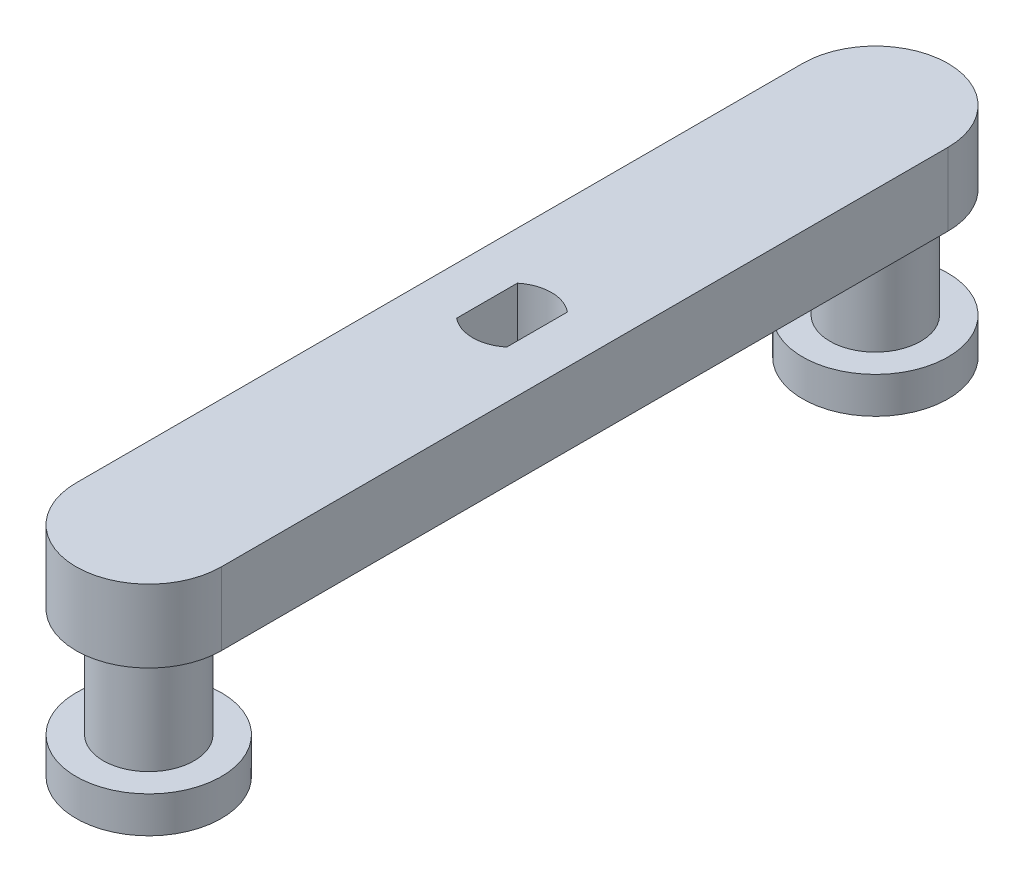
ISO-10303-21;
HEADER;
FILE_DESCRIPTION(('STEP AP214'),'2;1');
FILE_NAME('part.step','',(''),(''),'','','');
FILE_SCHEMA(('AUTOMOTIVE_DESIGN { 1 0 10303 214 1 1 1 1 }'));
ENDSEC;
DATA;
#1=APPLICATION_CONTEXT('core data for automotive mechanical design processes');
#2=APPLICATION_PROTOCOL_DEFINITION('international standard','automotive_design',2000,#1);
#3=PRODUCT_CONTEXT('',#1,'mechanical');
#4=PRODUCT('Part','Part','',(#3));
#5=PRODUCT_RELATED_PRODUCT_CATEGORY('part','',(#4));
#6=PRODUCT_DEFINITION_FORMATION('','',#4);
#7=PRODUCT_DEFINITION_CONTEXT('part definition',#1,'design');
#8=PRODUCT_DEFINITION('design','',#6,#7);
#9=PRODUCT_DEFINITION_SHAPE('','',#8);
#10=(LENGTH_UNIT() NAMED_UNIT(*) SI_UNIT(.MILLI.,.METRE.));
#11=(NAMED_UNIT(*) PLANE_ANGLE_UNIT() SI_UNIT($,.RADIAN.));
#12=(NAMED_UNIT(*) SI_UNIT($,.STERADIAN.) SOLID_ANGLE_UNIT());
#13=UNCERTAINTY_MEASURE_WITH_UNIT(LENGTH_MEASURE(1.E-05),#10,'distance_accuracy_value','');
#14=(GEOMETRIC_REPRESENTATION_CONTEXT(3) GLOBAL_UNCERTAINTY_ASSIGNED_CONTEXT((#13)) GLOBAL_UNIT_ASSIGNED_CONTEXT((#10,
#11,#12)) REPRESENTATION_CONTEXT('',''));
#15=CARTESIAN_POINT('',(0.,0.,0.));
#16=DIRECTION('',(0.,0.,1.));
#17=DIRECTION('',(1.,0.,0.));
#18=AXIS2_PLACEMENT_3D('',#15,#16,#17);
#19=CARTESIAN_POINT('',(0.,5.08,25.4));
#20=DIRECTION('',(0.,-1.,0.));
#21=DIRECTION('',(0.,0.,-1.));
#22=AXIS2_PLACEMENT_3D('',#19,#20,#21);
#23=CYLINDRICAL_SURFACE('',#22,5.08);
#24=CARTESIAN_POINT('',(0.,0.,25.4));
#25=DIRECTION('',(0.,1.,0.));
#26=DIRECTION('',(0.,0.,1.));
#27=AXIS2_PLACEMENT_3D('',#24,#25,#26);
#28=CIRCLE('',#27,5.08);
#29=CARTESIAN_POINT('',(-5.08,0.,25.4));
#30=VERTEX_POINT('',#29);
#31=CARTESIAN_POINT('',(5.08,0.,25.4));
#32=VERTEX_POINT('',#31);
#33=EDGE_CURVE('E151',#30,#32,#28,.T.);
#34=ORIENTED_EDGE('',*,*,#33,.T.);
#35=DIRECTION('',(0.,-1.,0.));
#36=VECTOR('',#35,1.);
#37=CARTESIAN_POINT('',(5.08,5.08,25.4));
#38=LINE('',#37,#36);
#39=CARTESIAN_POINT('',(5.08,5.08,25.4));
#40=VERTEX_POINT('',#39);
#41=EDGE_CURVE('E178',#40,#32,#38,.T.);
#42=ORIENTED_EDGE('',*,*,#41,.F.);
#43=CARTESIAN_POINT('',(0.,5.08,25.4));
#44=DIRECTION('',(0.,1.,0.));
#45=DIRECTION('',(0.,0.,1.));
#46=AXIS2_PLACEMENT_3D('',#43,#44,#45);
#47=CIRCLE('',#46,5.08);
#48=CARTESIAN_POINT('',(-5.08,5.08,25.4));
#49=VERTEX_POINT('',#48);
#50=EDGE_CURVE('E152',#49,#40,#47,.T.);
#51=ORIENTED_EDGE('',*,*,#50,.F.);
#52=DIRECTION('',(0.,-1.,0.));
#53=VECTOR('',#52,1.);
#54=CARTESIAN_POINT('',(-5.08,5.08,25.4));
#55=LINE('',#54,#53);
#56=EDGE_CURVE('E162',#49,#30,#55,.T.);
#57=ORIENTED_EDGE('',*,*,#56,.T.);
#58=EDGE_LOOP('',(#34,#42,#51,#57));
#59=FACE_BOUND('',#58,.T.);
#60=ADVANCED_FACE('F33',(#59),#23,.T.);
#61=CARTESIAN_POINT('',(5.08,5.08,25.4));
#62=DIRECTION('',(-1.,0.,0.));
#63=DIRECTION('',(0.,0.,1.));
#64=AXIS2_PLACEMENT_3D('',#61,#62,#63);
#65=PLANE('',#64);
#66=DIRECTION('',(0.,0.,-1.));
#67=VECTOR('',#66,1.);
#68=CARTESIAN_POINT('',(5.08,0.,25.4));
#69=LINE('',#68,#67);
#70=CARTESIAN_POINT('',(5.08,0.,-25.4));
#71=VERTEX_POINT('',#70);
#72=EDGE_CURVE('E165',#32,#71,#69,.T.);
#73=ORIENTED_EDGE('',*,*,#72,.T.);
#74=DIRECTION('',(0.,-1.,0.));
#75=VECTOR('',#74,1.);
#76=CARTESIAN_POINT('',(5.08,5.08,-25.4));
#77=LINE('',#76,#75);
#78=CARTESIAN_POINT('',(5.08,5.08,-25.4));
#79=VERTEX_POINT('',#78);
#80=EDGE_CURVE('E175',#79,#71,#77,.T.);
#81=ORIENTED_EDGE('',*,*,#80,.F.);
#82=DIRECTION('',(0.,0.,-1.));
#83=VECTOR('',#82,1.);
#84=CARTESIAN_POINT('',(5.08,5.08,25.4));
#85=LINE('',#84,#83);
#86=EDGE_CURVE('E155',#40,#79,#85,.T.);
#87=ORIENTED_EDGE('',*,*,#86,.F.);
#88=ORIENTED_EDGE('',*,*,#41,.T.);
#89=EDGE_LOOP('',(#73,#81,#87,#88));
#90=FACE_BOUND('',#89,.T.);
#91=ADVANCED_FACE('F205',(#90),#65,.F.);
#92=CARTESIAN_POINT('',(0.,5.08,-25.4));
#93=DIRECTION('',(0.,-1.,0.));
#94=DIRECTION('',(0.,0.,-1.));
#95=AXIS2_PLACEMENT_3D('',#92,#93,#94);
#96=CYLINDRICAL_SURFACE('',#95,5.08);
#97=CARTESIAN_POINT('',(0.,0.,-25.4));
#98=DIRECTION('',(0.,1.,0.));
#99=DIRECTION('',(0.,0.,1.));
#100=AXIS2_PLACEMENT_3D('',#97,#98,#99);
#101=CIRCLE('',#100,5.08);
#102=CARTESIAN_POINT('',(-5.08,0.,-25.4));
#103=VERTEX_POINT('',#102);
#104=EDGE_CURVE('E167',#71,#103,#101,.T.);
#105=ORIENTED_EDGE('',*,*,#104,.T.);
#106=DIRECTION('',(0.,-1.,0.));
#107=VECTOR('',#106,1.);
#108=CARTESIAN_POINT('',(-5.08,5.08,-25.4));
#109=LINE('',#108,#107);
#110=CARTESIAN_POINT('',(-5.08,5.08,-25.4));
#111=VERTEX_POINT('',#110);
#112=EDGE_CURVE('E172',#111,#103,#109,.T.);
#113=ORIENTED_EDGE('',*,*,#112,.F.);
#114=CARTESIAN_POINT('',(0.,5.08,-25.4));
#115=DIRECTION('',(0.,1.,0.));
#116=DIRECTION('',(0.,0.,1.));
#117=AXIS2_PLACEMENT_3D('',#114,#115,#116);
#118=CIRCLE('',#117,5.08);
#119=EDGE_CURVE('E158',#79,#111,#118,.T.);
#120=ORIENTED_EDGE('',*,*,#119,.F.);
#121=ORIENTED_EDGE('',*,*,#80,.T.);
#122=EDGE_LOOP('',(#105,#113,#120,#121));
#123=FACE_BOUND('',#122,.T.);
#124=ADVANCED_FACE('F202',(#123),#96,.T.);
#125=CARTESIAN_POINT('',(-5.08,5.08,-25.4));
#126=DIRECTION('',(1.,0.,0.));
#127=DIRECTION('',(0.,0.,-1.));
#128=AXIS2_PLACEMENT_3D('',#125,#126,#127);
#129=PLANE('',#128);
#130=DIRECTION('',(0.,0.,1.));
#131=VECTOR('',#130,1.);
#132=CARTESIAN_POINT('',(-5.08,0.,-25.4));
#133=LINE('',#132,#131);
#134=EDGE_CURVE('E156',#103,#30,#133,.T.);
#135=ORIENTED_EDGE('',*,*,#134,.T.);
#136=ORIENTED_EDGE('',*,*,#56,.F.);
#137=DIRECTION('',(0.,0.,1.));
#138=VECTOR('',#137,1.);
#139=CARTESIAN_POINT('',(-5.08,5.08,-25.4));
#140=LINE('',#139,#138);
#141=EDGE_CURVE('E160',#111,#49,#140,.T.);
#142=ORIENTED_EDGE('',*,*,#141,.F.);
#143=ORIENTED_EDGE('',*,*,#112,.T.);
#144=EDGE_LOOP('',(#135,#136,#142,#143));
#145=FACE_BOUND('',#144,.T.);
#146=ADVANCED_FACE('F198',(#145),#129,.F.);
#147=CARTESIAN_POINT('',(0.,5.08,25.4));
#148=DIRECTION('',(0.,1.,0.));
#149=DIRECTION('',(0.,0.,1.));
#150=AXIS2_PLACEMENT_3D('',#147,#148,#149);
#151=PLANE('',#150);
#152=CARTESIAN_POINT('',(0.,5.08,0.));
#153=DIRECTION('',(0.,1.,0.));
#154=DIRECTION('',(0.,0.,1.));
#155=AXIS2_PLACEMENT_3D('',#152,#153,#154);
#156=CIRCLE('',#155,2.75);
#157=CARTESIAN_POINT('',(-1.75,5.08,2.12132034355964));
#158=VERTEX_POINT('',#157);
#159=CARTESIAN_POINT('',(1.75,5.08,2.12132034355964));
#160=VERTEX_POINT('',#159);
#161=EDGE_CURVE('E47',#158,#160,#156,.T.);
#162=ORIENTED_EDGE('',*,*,#161,.F.);
#163=DIRECTION('',(0.,0.,1.));
#164=VECTOR('',#163,1.);
#165=CARTESIAN_POINT('',(-1.75,5.08,-2.12132034355964));
#166=LINE('',#165,#164);
#167=CARTESIAN_POINT('',(-1.75,5.08,-2.12132034355964));
#168=VERTEX_POINT('',#167);
#169=EDGE_CURVE('E105',#168,#158,#166,.T.);
#170=ORIENTED_EDGE('',*,*,#169,.F.);
#171=CARTESIAN_POINT('',(0.,5.08,0.));
#172=DIRECTION('',(0.,1.,0.));
#173=DIRECTION('',(0.,0.,1.));
#174=AXIS2_PLACEMENT_3D('',#171,#172,#173);
#175=CIRCLE('',#174,2.75);
#176=CARTESIAN_POINT('',(1.75,5.08,-2.12132034355964));
#177=VERTEX_POINT('',#176);
#178=EDGE_CURVE('E125',#177,#168,#175,.T.);
#179=ORIENTED_EDGE('',*,*,#178,.F.);
#180=DIRECTION('',(0.,0.,-1.));
#181=VECTOR('',#180,1.);
#182=CARTESIAN_POINT('',(1.75,5.08,-2.12132034355964));
#183=LINE('',#182,#181);
#184=EDGE_CURVE('E119',#160,#177,#183,.T.);
#185=ORIENTED_EDGE('',*,*,#184,.F.);
#186=EDGE_LOOP('',(#162,#170,#179,#185));
#187=FACE_BOUND('',#186,.T.);
#188=ORIENTED_EDGE('',*,*,#50,.T.);
#189=ORIENTED_EDGE('',*,*,#86,.T.);
#190=ORIENTED_EDGE('',*,*,#119,.T.);
#191=ORIENTED_EDGE('',*,*,#141,.T.);
#192=EDGE_LOOP('',(#188,#189,#190,#191));
#193=FACE_BOUND('',#192,.T.);
#194=ADVANCED_FACE('F187',(#187,#193),#151,.T.);
#195=CARTESIAN_POINT('',(0.,0.,25.4));
#196=DIRECTION('',(0.,1.,0.));
#197=DIRECTION('',(0.,0.,1.));
#198=AXIS2_PLACEMENT_3D('',#195,#196,#197);
#199=PLANE('',#198);
#200=DIRECTION('',(0.,0.,-1.));
#201=VECTOR('',#200,1.);
#202=CARTESIAN_POINT('',(-1.75,0.,-2.12132034355964));
#203=LINE('',#202,#201);
#204=CARTESIAN_POINT('',(-1.75,0.,2.12132034355964));
#205=VERTEX_POINT('',#204);
#206=CARTESIAN_POINT('',(-1.75,0.,-2.12132034355964));
#207=VERTEX_POINT('',#206);
#208=EDGE_CURVE('E117',#205,#207,#203,.T.);
#209=ORIENTED_EDGE('',*,*,#208,.F.);
#210=CARTESIAN_POINT('',(0.,0.,0.));
#211=DIRECTION('',(0.,1.,0.));
#212=DIRECTION('',(0.,0.,1.));
#213=AXIS2_PLACEMENT_3D('',#210,#211,#212);
#214=CIRCLE('',#213,2.75);
#215=CARTESIAN_POINT('',(1.75,0.,2.12132034355964));
#216=VERTEX_POINT('',#215);
#217=EDGE_CURVE('E99',#216,#205,#214,.F.);
#218=ORIENTED_EDGE('',*,*,#217,.F.);
#219=DIRECTION('',(0.,0.,1.));
#220=VECTOR('',#219,1.);
#221=CARTESIAN_POINT('',(1.75,0.,-2.12132034355964));
#222=LINE('',#221,#220);
#223=CARTESIAN_POINT('',(1.75,0.,-2.12132034355964));
#224=VERTEX_POINT('',#223);
#225=EDGE_CURVE('E108',#224,#216,#222,.T.);
#226=ORIENTED_EDGE('',*,*,#225,.F.);
#227=CARTESIAN_POINT('',(0.,0.,0.));
#228=DIRECTION('',(0.,1.,0.));
#229=DIRECTION('',(0.,0.,1.));
#230=AXIS2_PLACEMENT_3D('',#227,#228,#229);
#231=CIRCLE('',#230,2.75);
#232=EDGE_CURVE('E55',#207,#224,#231,.F.);
#233=ORIENTED_EDGE('',*,*,#232,.F.);
#234=EDGE_LOOP('',(#209,#218,#226,#233));
#235=FACE_BOUND('',#234,.T.);
#236=CARTESIAN_POINT('',(0.,0.,-25.4));
#237=DIRECTION('',(0.,1.,0.));
#238=DIRECTION('',(0.,0.,1.));
#239=AXIS2_PLACEMENT_3D('',#236,#237,#238);
#240=CIRCLE('',#239,3.175);
#241=CARTESIAN_POINT('',(0.,0.,-22.225));
#242=VERTEX_POINT('',#241);
#243=EDGE_CURVE('E11',#242,#242,#240,.F.);
#244=ORIENTED_EDGE('',*,*,#243,.F.);
#245=EDGE_LOOP('',(#244));
#246=FACE_BOUND('',#245,.T.);
#247=CARTESIAN_POINT('',(0.,0.,25.4));
#248=DIRECTION('',(0.,1.,0.));
#249=DIRECTION('',(0.,0.,1.));
#250=AXIS2_PLACEMENT_3D('',#247,#248,#249);
#251=CIRCLE('',#250,3.175);
#252=CARTESIAN_POINT('',(0.,0.,28.575));
#253=VERTEX_POINT('',#252);
#254=EDGE_CURVE('E40',#253,#253,#251,.F.);
#255=ORIENTED_EDGE('',*,*,#254,.F.);
#256=EDGE_LOOP('',(#255));
#257=FACE_BOUND('',#256,.T.);
#258=ORIENTED_EDGE('',*,*,#33,.F.);
#259=ORIENTED_EDGE('',*,*,#134,.F.);
#260=ORIENTED_EDGE('',*,*,#104,.F.);
#261=ORIENTED_EDGE('',*,*,#72,.F.);
#262=EDGE_LOOP('',(#258,#259,#260,#261));
#263=FACE_BOUND('',#262,.T.);
#264=ADVANCED_FACE('F114',(#235,#246,#257,#263),#199,.F.);
#265=CARTESIAN_POINT('',(0.,-7.62,25.4));
#266=DIRECTION('',(0.,1.,0.));
#267=DIRECTION('',(0.,0.,1.));
#268=AXIS2_PLACEMENT_3D('',#265,#266,#267);
#269=CYLINDRICAL_SURFACE('',#268,3.175);
#270=CARTESIAN_POINT('',(0.,-7.62,25.4));
#271=DIRECTION('',(0.,-1.,0.));
#272=DIRECTION('',(0.,0.,-1.));
#273=AXIS2_PLACEMENT_3D('',#270,#271,#272);
#274=CIRCLE('',#273,3.175);
#275=CARTESIAN_POINT('',(0.,-7.62,28.575));
#276=VERTEX_POINT('',#275);
#277=EDGE_CURVE('E148',#276,#276,#274,.T.);
#278=CARTESIAN_POINT('',(0.,-7.62,28.575));
#279=CARTESIAN_POINT('',(0.,-7.540625,28.575));
#280=CARTESIAN_POINT('',(0.,-7.46125,28.575));
#281=CARTESIAN_POINT('',(0.,-7.3025,28.575));
#282=CARTESIAN_POINT('',(0.,-7.223125,28.575));
#283=CARTESIAN_POINT('',(0.,-7.064375,28.575));
#284=CARTESIAN_POINT('',(0.,-6.985,28.575));
#285=CARTESIAN_POINT('',(0.,-6.82625,28.575));
#286=CARTESIAN_POINT('',(0.,-6.746875,28.575));
#287=CARTESIAN_POINT('',(0.,-6.588125,28.575));
#288=CARTESIAN_POINT('',(0.,-6.50875,28.575));
#289=CARTESIAN_POINT('',(0.,-6.35,28.575));
#290=CARTESIAN_POINT('',(0.,-6.270625,28.575));
#291=CARTESIAN_POINT('',(0.,-6.111875,28.575));
#292=CARTESIAN_POINT('',(0.,-6.0325,28.575));
#293=CARTESIAN_POINT('',(0.,-5.87375,28.575));
#294=CARTESIAN_POINT('',(0.,-5.794375,28.575));
#295=CARTESIAN_POINT('',(0.,-5.635625,28.575));
#296=CARTESIAN_POINT('',(0.,-5.55625,28.575));
#297=CARTESIAN_POINT('',(0.,-5.3975,28.575));
#298=CARTESIAN_POINT('',(0.,-5.318125,28.575));
#299=CARTESIAN_POINT('',(0.,-5.159375,28.575));
#300=CARTESIAN_POINT('',(0.,-5.08,28.575));
#301=CARTESIAN_POINT('',(0.,-4.92125,28.575));
#302=CARTESIAN_POINT('',(0.,-4.841875,28.575));
#303=CARTESIAN_POINT('',(0.,-4.683125,28.575));
#304=CARTESIAN_POINT('',(0.,-4.60375,28.575));
#305=CARTESIAN_POINT('',(0.,-4.445,28.575));
#306=CARTESIAN_POINT('',(0.,-4.365625,28.575));
#307=CARTESIAN_POINT('',(0.,-4.206875,28.575));
#308=CARTESIAN_POINT('',(0.,-4.1275,28.575));
#309=CARTESIAN_POINT('',(0.,-3.96875,28.575));
#310=CARTESIAN_POINT('',(0.,-3.889375,28.575));
#311=CARTESIAN_POINT('',(0.,-3.730625,28.575));
#312=CARTESIAN_POINT('',(0.,-3.65125,28.575));
#313=CARTESIAN_POINT('',(0.,-3.4925,28.575));
#314=CARTESIAN_POINT('',(0.,-3.413125,28.575));
#315=CARTESIAN_POINT('',(0.,-3.254375,28.575));
#316=CARTESIAN_POINT('',(0.,-3.175,28.575));
#317=CARTESIAN_POINT('',(0.,-3.01625,28.575));
#318=CARTESIAN_POINT('',(0.,-2.936875,28.575));
#319=CARTESIAN_POINT('',(0.,-2.778125,28.575));
#320=CARTESIAN_POINT('',(0.,-2.69875,28.575));
#321=CARTESIAN_POINT('',(0.,-2.54,28.575));
#322=CARTESIAN_POINT('',(0.,-2.460625,28.575));
#323=CARTESIAN_POINT('',(0.,-2.301875,28.575));
#324=CARTESIAN_POINT('',(0.,-2.2225,28.575));
#325=CARTESIAN_POINT('',(0.,-2.06375,28.575));
#326=CARTESIAN_POINT('',(0.,-1.984375,28.575));
#327=CARTESIAN_POINT('',(0.,-1.825625,28.575));
#328=CARTESIAN_POINT('',(0.,-1.74625,28.575));
#329=CARTESIAN_POINT('',(0.,-1.5875,28.575));
#330=CARTESIAN_POINT('',(0.,-1.508125,28.575));
#331=CARTESIAN_POINT('',(0.,-1.349375,28.575));
#332=CARTESIAN_POINT('',(0.,-1.27,28.575));
#333=CARTESIAN_POINT('',(0.,-1.11125,28.575));
#334=CARTESIAN_POINT('',(0.,-1.031875,28.575));
#335=CARTESIAN_POINT('',(0.,-0.873125,28.575));
#336=CARTESIAN_POINT('',(0.,-0.79375,28.575));
#337=CARTESIAN_POINT('',(0.,-0.635,28.575));
#338=CARTESIAN_POINT('',(0.,-0.555625,28.575));
#339=CARTESIAN_POINT('',(0.,-0.396875,28.575));
#340=CARTESIAN_POINT('',(0.,-0.3175,28.575));
#341=CARTESIAN_POINT('',(0.,-0.15875,28.575));
#342=CARTESIAN_POINT('',(0.,-0.0793749999999999,28.575));
#343=CARTESIAN_POINT('',(0.,0.,28.575));
#344=B_SPLINE_CURVE_WITH_KNOTS('',3,(#278,#279,#280,#281,#282,#283,#284,#285,#286,#287,#288,
#289,#290,#291,#292,#293,#294,#295,#296,#297,#298,#299,#300,#301,#302,#303,#304,#305,#306,#307,
#308,#309,#310,#311,#312,#313,#314,#315,#316,#317,#318,#319,#320,#321,#322,#323,#324,#325,#326,
#327,#328,#329,#330,#331,#332,#333,#334,#335,#336,#337,#338,#339,#340,#341,#342,#343),
.UNSPECIFIED.,.F.,.F.,(4,2,2,2,2,2,2,2,2,2,2,2,2,2,2,2,2,2,2,2,2,2,2,2,2,2,2,2,2,2,2,2,4),(0.,
0.238125,0.47625,0.714375000000001,0.9525,1.190625,1.42875,1.666875,1.905,2.143125,2.38125,
2.619375,2.8575,3.095625,3.33375,3.571875,3.81,4.048125,4.28625,4.524375,4.7625,5.000625,
5.23875,5.476875,5.715,5.953125,6.19125,6.429375,6.6675,6.905625,7.14375,7.381875,7.62),.UNSPECIFIED.);
#345=EDGE_CURVE('BSEAM183',#276,#253,#344,.T.);
#346=ORIENTED_EDGE('',*,*,#277,.F.);
#347=ORIENTED_EDGE('',*,*,#254,.T.);
#348=ORIENTED_EDGE('',*,*,#345,.T.);
#349=ORIENTED_EDGE('',*,*,#345,.F.);
#350=EDGE_LOOP('',(#346,#348,#347,#349));
#351=FACE_BOUND('',#350,.T.);
#352=ADVANCED_FACE('F183',(#351),#269,.T.);
#353=CARTESIAN_POINT('',(0.,-7.62,-25.4));
#354=DIRECTION('',(0.,1.,0.));
#355=DIRECTION('',(0.,0.,1.));
#356=AXIS2_PLACEMENT_3D('',#353,#354,#355);
#357=CYLINDRICAL_SURFACE('',#356,3.175);
#358=CARTESIAN_POINT('',(0.,-7.62,-25.4));
#359=DIRECTION('',(0.,-1.,0.));
#360=DIRECTION('',(0.,0.,-1.));
#361=AXIS2_PLACEMENT_3D('',#358,#359,#360);
#362=CIRCLE('',#361,3.175);
#363=CARTESIAN_POINT('',(0.,-7.62,-22.225));
#364=VERTEX_POINT('',#363);
#365=EDGE_CURVE('E143',#364,#364,#362,.T.);
#366=CARTESIAN_POINT('',(0.,-7.62,-22.225));
#367=CARTESIAN_POINT('',(0.,-7.540625,-22.225));
#368=CARTESIAN_POINT('',(0.,-7.46125,-22.225));
#369=CARTESIAN_POINT('',(0.,-7.3025,-22.225));
#370=CARTESIAN_POINT('',(0.,-7.223125,-22.225));
#371=CARTESIAN_POINT('',(0.,-7.064375,-22.225));
#372=CARTESIAN_POINT('',(0.,-6.985,-22.225));
#373=CARTESIAN_POINT('',(0.,-6.82625,-22.225));
#374=CARTESIAN_POINT('',(0.,-6.746875,-22.225));
#375=CARTESIAN_POINT('',(0.,-6.588125,-22.225));
#376=CARTESIAN_POINT('',(0.,-6.50875,-22.225));
#377=CARTESIAN_POINT('',(0.,-6.35,-22.225));
#378=CARTESIAN_POINT('',(0.,-6.270625,-22.225));
#379=CARTESIAN_POINT('',(0.,-6.111875,-22.225));
#380=CARTESIAN_POINT('',(0.,-6.0325,-22.225));
#381=CARTESIAN_POINT('',(0.,-5.87375,-22.225));
#382=CARTESIAN_POINT('',(0.,-5.794375,-22.225));
#383=CARTESIAN_POINT('',(0.,-5.635625,-22.225));
#384=CARTESIAN_POINT('',(0.,-5.55625,-22.225));
#385=CARTESIAN_POINT('',(0.,-5.3975,-22.225));
#386=CARTESIAN_POINT('',(0.,-5.318125,-22.225));
#387=CARTESIAN_POINT('',(0.,-5.159375,-22.225));
#388=CARTESIAN_POINT('',(0.,-5.08,-22.225));
#389=CARTESIAN_POINT('',(0.,-4.92125,-22.225));
#390=CARTESIAN_POINT('',(0.,-4.841875,-22.225));
#391=CARTESIAN_POINT('',(0.,-4.683125,-22.225));
#392=CARTESIAN_POINT('',(0.,-4.60375,-22.225));
#393=CARTESIAN_POINT('',(0.,-4.445,-22.225));
#394=CARTESIAN_POINT('',(0.,-4.365625,-22.225));
#395=CARTESIAN_POINT('',(0.,-4.206875,-22.225));
#396=CARTESIAN_POINT('',(0.,-4.1275,-22.225));
#397=CARTESIAN_POINT('',(0.,-3.96875,-22.225));
#398=CARTESIAN_POINT('',(0.,-3.889375,-22.225));
#399=CARTESIAN_POINT('',(0.,-3.730625,-22.225));
#400=CARTESIAN_POINT('',(0.,-3.65125,-22.225));
#401=CARTESIAN_POINT('',(0.,-3.4925,-22.225));
#402=CARTESIAN_POINT('',(0.,-3.413125,-22.225));
#403=CARTESIAN_POINT('',(0.,-3.254375,-22.225));
#404=CARTESIAN_POINT('',(0.,-3.175,-22.225));
#405=CARTESIAN_POINT('',(0.,-3.01625,-22.225));
#406=CARTESIAN_POINT('',(0.,-2.936875,-22.225));
#407=CARTESIAN_POINT('',(0.,-2.778125,-22.225));
#408=CARTESIAN_POINT('',(0.,-2.69875,-22.225));
#409=CARTESIAN_POINT('',(0.,-2.54,-22.225));
#410=CARTESIAN_POINT('',(0.,-2.460625,-22.225));
#411=CARTESIAN_POINT('',(0.,-2.301875,-22.225));
#412=CARTESIAN_POINT('',(0.,-2.2225,-22.225));
#413=CARTESIAN_POINT('',(0.,-2.06375,-22.225));
#414=CARTESIAN_POINT('',(0.,-1.984375,-22.225));
#415=CARTESIAN_POINT('',(0.,-1.825625,-22.225));
#416=CARTESIAN_POINT('',(0.,-1.74625,-22.225));
#417=CARTESIAN_POINT('',(0.,-1.5875,-22.225));
#418=CARTESIAN_POINT('',(0.,-1.508125,-22.225));
#419=CARTESIAN_POINT('',(0.,-1.349375,-22.225));
#420=CARTESIAN_POINT('',(0.,-1.27,-22.225));
#421=CARTESIAN_POINT('',(0.,-1.11125,-22.225));
#422=CARTESIAN_POINT('',(0.,-1.031875,-22.225));
#423=CARTESIAN_POINT('',(0.,-0.873125,-22.225));
#424=CARTESIAN_POINT('',(0.,-0.79375,-22.225));
#425=CARTESIAN_POINT('',(0.,-0.635,-22.225));
#426=CARTESIAN_POINT('',(0.,-0.555625,-22.225));
#427=CARTESIAN_POINT('',(0.,-0.396875,-22.225));
#428=CARTESIAN_POINT('',(0.,-0.3175,-22.225));
#429=CARTESIAN_POINT('',(0.,-0.15875,-22.225));
#430=CARTESIAN_POINT('',(0.,-0.0793749999999999,-22.225));
#431=CARTESIAN_POINT('',(0.,0.,-22.225));
#432=B_SPLINE_CURVE_WITH_KNOTS('',3,(#366,#367,#368,#369,#370,#371,#372,#373,#374,#375,#376,
#377,#378,#379,#380,#381,#382,#383,#384,#385,#386,#387,#388,#389,#390,#391,#392,#393,#394,#395,
#396,#397,#398,#399,#400,#401,#402,#403,#404,#405,#406,#407,#408,#409,#410,#411,#412,#413,#414,
#415,#416,#417,#418,#419,#420,#421,#422,#423,#424,#425,#426,#427,#428,#429,#430,#431),
.UNSPECIFIED.,.F.,.F.,(4,2,2,2,2,2,2,2,2,2,2,2,2,2,2,2,2,2,2,2,2,2,2,2,2,2,2,2,2,2,2,2,4),(0.,
0.238125,0.47625,0.714375000000001,0.9525,1.190625,1.42875,1.666875,1.905,2.143125,2.38125,
2.619375,2.8575,3.095625,3.33375,3.571875,3.81,4.048125,4.28625,4.524375,4.7625,5.000625,
5.23875,5.476875,5.715,5.953125,6.19125,6.429375,6.6675,6.905625,7.14375,7.381875,7.62),.UNSPECIFIED.);
#433=EDGE_CURVE('BSEAM248',#364,#242,#432,.T.);
#434=ORIENTED_EDGE('',*,*,#365,.F.);
#435=ORIENTED_EDGE('',*,*,#243,.T.);
#436=ORIENTED_EDGE('',*,*,#433,.T.);
#437=ORIENTED_EDGE('',*,*,#433,.F.);
#438=EDGE_LOOP('',(#434,#436,#435,#437));
#439=FACE_BOUND('',#438,.T.);
#440=ADVANCED_FACE('F248',(#439),#357,.T.);
#441=CARTESIAN_POINT('',(0.,-10.16,25.4));
#442=DIRECTION('',(0.,1.,0.));
#443=DIRECTION('',(0.,0.,1.));
#444=AXIS2_PLACEMENT_3D('',#441,#442,#443);
#445=CYLINDRICAL_SURFACE('',#444,5.08);
#446=CARTESIAN_POINT('',(0.,-10.16,25.4));
#447=DIRECTION('',(0.,-1.,0.));
#448=DIRECTION('',(0.,0.,-1.));
#449=AXIS2_PLACEMENT_3D('',#446,#447,#448);
#450=CIRCLE('',#449,5.08);
#451=CARTESIAN_POINT('',(0.,-10.16,20.32));
#452=VERTEX_POINT('',#451);
#453=EDGE_CURVE('E140',#452,#452,#450,.T.);
#454=ORIENTED_EDGE('',*,*,#453,.F.);
#455=EDGE_LOOP('',(#454));
#456=FACE_BOUND('',#455,.T.);
#457=CARTESIAN_POINT('',(0.,-7.62,25.4));
#458=DIRECTION('',(0.,-1.,0.));
#459=DIRECTION('',(0.,0.,-1.));
#460=AXIS2_PLACEMENT_3D('',#457,#458,#459);
#461=CIRCLE('',#460,5.08);
#462=CARTESIAN_POINT('',(0.,-7.62,20.32));
#463=VERTEX_POINT('',#462);
#464=EDGE_CURVE('E137',#463,#463,#461,.T.);
#465=ORIENTED_EDGE('',*,*,#464,.T.);
#466=EDGE_LOOP('',(#465));
#467=FACE_BOUND('',#466,.T.);
#468=ADVANCED_FACE('F254',(#456,#467),#445,.T.);
#469=CARTESIAN_POINT('',(0.,-10.16,25.4));
#470=DIRECTION('',(0.,-1.,0.));
#471=DIRECTION('',(0.,0.,-1.));
#472=AXIS2_PLACEMENT_3D('',#469,#470,#471);
#473=PLANE('',#472);
#474=ORIENTED_EDGE('',*,*,#453,.T.);
#475=EDGE_LOOP('',(#474));
#476=FACE_BOUND('',#475,.T.);
#477=ADVANCED_FACE('F262',(#476),#473,.T.);
#478=CARTESIAN_POINT('',(0.,-7.62,25.4));
#479=DIRECTION('',(0.,-1.,0.));
#480=DIRECTION('',(0.,0.,-1.));
#481=AXIS2_PLACEMENT_3D('',#478,#479,#480);
#482=PLANE('',#481);
#483=ORIENTED_EDGE('',*,*,#277,.T.);
#484=EDGE_LOOP('',(#483));
#485=FACE_BOUND('',#484,.T.);
#486=ORIENTED_EDGE('',*,*,#464,.F.);
#487=EDGE_LOOP('',(#486));
#488=FACE_BOUND('',#487,.T.);
#489=ADVANCED_FACE('F270',(#485,#488),#482,.F.);
#490=CARTESIAN_POINT('',(0.,-10.16,-25.4));
#491=DIRECTION('',(0.,1.,0.));
#492=DIRECTION('',(0.,0.,1.));
#493=AXIS2_PLACEMENT_3D('',#490,#491,#492);
#494=CYLINDRICAL_SURFACE('',#493,5.08);
#495=CARTESIAN_POINT('',(0.,-10.16,-25.4));
#496=DIRECTION('',(0.,-1.,0.));
#497=DIRECTION('',(0.,0.,-1.));
#498=AXIS2_PLACEMENT_3D('',#495,#496,#497);
#499=CIRCLE('',#498,5.08);
#500=CARTESIAN_POINT('',(0.,-10.16,-30.48));
#501=VERTEX_POINT('',#500);
#502=EDGE_CURVE('E134',#501,#501,#499,.T.);
#503=ORIENTED_EDGE('',*,*,#502,.F.);
#504=EDGE_LOOP('',(#503));
#505=FACE_BOUND('',#504,.T.);
#506=CARTESIAN_POINT('',(0.,-7.62,-25.4));
#507=DIRECTION('',(0.,-1.,0.));
#508=DIRECTION('',(0.,0.,-1.));
#509=AXIS2_PLACEMENT_3D('',#506,#507,#508);
#510=CIRCLE('',#509,5.08);
#511=CARTESIAN_POINT('',(0.,-7.62,-30.48));
#512=VERTEX_POINT('',#511);
#513=EDGE_CURVE('E111',#512,#512,#510,.T.);
#514=ORIENTED_EDGE('',*,*,#513,.T.);
#515=EDGE_LOOP('',(#514));
#516=FACE_BOUND('',#515,.T.);
#517=ADVANCED_FACE('F278',(#505,#516),#494,.T.);
#518=CARTESIAN_POINT('',(0.,-10.16,-25.4));
#519=DIRECTION('',(0.,-1.,0.));
#520=DIRECTION('',(0.,0.,-1.));
#521=AXIS2_PLACEMENT_3D('',#518,#519,#520);
#522=PLANE('',#521);
#523=ORIENTED_EDGE('',*,*,#502,.T.);
#524=EDGE_LOOP('',(#523));
#525=FACE_BOUND('',#524,.T.);
#526=ADVANCED_FACE('F286',(#525),#522,.T.);
#527=CARTESIAN_POINT('',(0.,-7.62,-25.4));
#528=DIRECTION('',(0.,-1.,0.));
#529=DIRECTION('',(0.,0.,-1.));
#530=AXIS2_PLACEMENT_3D('',#527,#528,#529);
#531=PLANE('',#530);
#532=ORIENTED_EDGE('',*,*,#365,.T.);
#533=EDGE_LOOP('',(#532));
#534=FACE_BOUND('',#533,.T.);
#535=ORIENTED_EDGE('',*,*,#513,.F.);
#536=EDGE_LOOP('',(#535));
#537=FACE_BOUND('',#536,.T.);
#538=ADVANCED_FACE('F294',(#534,#537),#531,.F.);
#539=CARTESIAN_POINT('',(0.,-10.161,0.));
#540=DIRECTION('',(0.,1.,0.));
#541=DIRECTION('',(0.,0.,1.));
#542=AXIS2_PLACEMENT_3D('',#539,#540,#541);
#543=CYLINDRICAL_SURFACE('',#542,2.75);
#544=ORIENTED_EDGE('',*,*,#217,.T.);
#545=DIRECTION('',(0.,1.,0.));
#546=VECTOR('',#545,1.);
#547=CARTESIAN_POINT('',(-1.75,-10.161,2.12132034355964));
#548=LINE('',#547,#546);
#549=EDGE_CURVE('E112',#205,#158,#548,.T.);
#550=ORIENTED_EDGE('',*,*,#549,.T.);
#551=ORIENTED_EDGE('',*,*,#161,.T.);
#552=DIRECTION('',(0.,1.,0.));
#553=VECTOR('',#552,1.);
#554=CARTESIAN_POINT('',(1.75,-10.161,2.12132034355964));
#555=LINE('',#554,#553);
#556=EDGE_CURVE('E95',#216,#160,#555,.T.);
#557=ORIENTED_EDGE('',*,*,#556,.F.);
#558=EDGE_LOOP('',(#544,#550,#551,#557));
#559=FACE_BOUND('',#558,.T.);
#560=ADVANCED_FACE('F97',(#559),#543,.F.);
#561=CARTESIAN_POINT('',(-1.75,-10.161,-2.12132034355964));
#562=DIRECTION('',(-1.,0.,0.));
#563=DIRECTION('',(0.,0.,1.));
#564=AXIS2_PLACEMENT_3D('',#561,#562,#563);
#565=PLANE('',#564);
#566=ORIENTED_EDGE('',*,*,#208,.T.);
#567=DIRECTION('',(0.,1.,0.));
#568=VECTOR('',#567,1.);
#569=CARTESIAN_POINT('',(-1.75,-10.161,-2.12132034355964));
#570=LINE('',#569,#568);
#571=EDGE_CURVE('E131',#207,#168,#570,.T.);
#572=ORIENTED_EDGE('',*,*,#571,.T.);
#573=ORIENTED_EDGE('',*,*,#169,.T.);
#574=ORIENTED_EDGE('',*,*,#549,.F.);
#575=EDGE_LOOP('',(#566,#572,#573,#574));
#576=FACE_BOUND('',#575,.T.);
#577=ADVANCED_FACE('F307',(#576),#565,.F.);
#578=CARTESIAN_POINT('',(0.,-10.161,0.));
#579=DIRECTION('',(0.,1.,0.));
#580=DIRECTION('',(0.,0.,1.));
#581=AXIS2_PLACEMENT_3D('',#578,#579,#580);
#582=CYLINDRICAL_SURFACE('',#581,2.75);
#583=ORIENTED_EDGE('',*,*,#232,.T.);
#584=DIRECTION('',(0.,1.,0.));
#585=VECTOR('',#584,1.);
#586=CARTESIAN_POINT('',(1.75,-10.161,-2.12132034355964));
#587=LINE('',#586,#585);
#588=EDGE_CURVE('E104',#224,#177,#587,.T.);
#589=ORIENTED_EDGE('',*,*,#588,.T.);
#590=ORIENTED_EDGE('',*,*,#178,.T.);
#591=ORIENTED_EDGE('',*,*,#571,.F.);
#592=EDGE_LOOP('',(#583,#589,#590,#591));
#593=FACE_BOUND('',#592,.T.);
#594=ADVANCED_FACE('F314',(#593),#582,.F.);
#595=CARTESIAN_POINT('',(1.75,-10.161,-2.12132034355964));
#596=DIRECTION('',(1.,0.,0.));
#597=DIRECTION('',(0.,0.,-1.));
#598=AXIS2_PLACEMENT_3D('',#595,#596,#597);
#599=PLANE('',#598);
#600=ORIENTED_EDGE('',*,*,#225,.T.);
#601=ORIENTED_EDGE('',*,*,#556,.T.);
#602=ORIENTED_EDGE('',*,*,#184,.T.);
#603=ORIENTED_EDGE('',*,*,#588,.F.);
#604=EDGE_LOOP('',(#600,#601,#602,#603));
#605=FACE_BOUND('',#604,.T.);
#606=ADVANCED_FACE('F109',(#605),#599,.F.);
#607=CLOSED_SHELL('',(#60,#91,#124,#146,#194,#264,#352,#440,#468,#477,#489,#517,#526,#538,#560,
#577,#594,#606));
#608=MANIFOLD_SOLID_BREP('B2',#607);
#609=ADVANCED_BREP_SHAPE_REPRESENTATION('',(#18,#608),#14);
#610=SHAPE_DEFINITION_REPRESENTATION(#9,#609);
ENDSEC;
END-ISO-10303-21;
